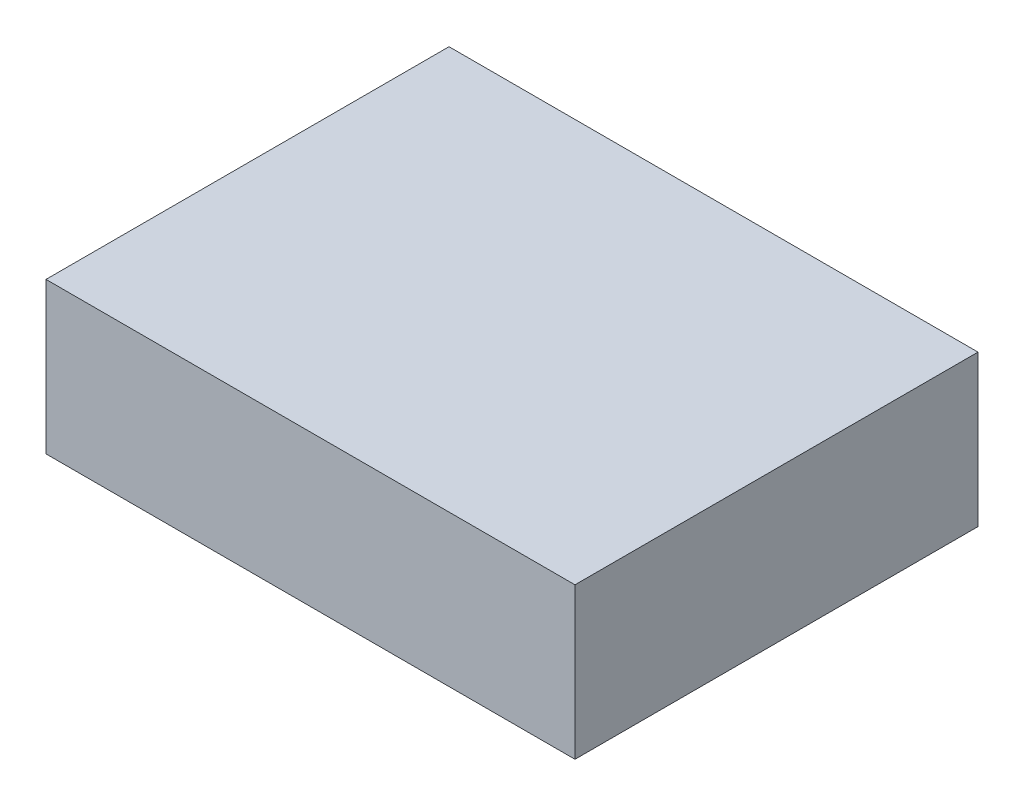
ISO-10303-21;
HEADER;
FILE_DESCRIPTION(('STEP AP214'),'2;1');
FILE_NAME('part.step','',(''),(''),'','','');
FILE_SCHEMA(('AUTOMOTIVE_DESIGN { 1 0 10303 214 1 1 1 1 }'));
ENDSEC;
DATA;
#1=APPLICATION_CONTEXT('core data for automotive mechanical design processes');
#2=APPLICATION_PROTOCOL_DEFINITION('international standard','automotive_design',2000,#1);
#3=PRODUCT_CONTEXT('',#1,'mechanical');
#4=PRODUCT('Part','Part','',(#3));
#5=PRODUCT_RELATED_PRODUCT_CATEGORY('part','',(#4));
#6=PRODUCT_DEFINITION_FORMATION('','',#4);
#7=PRODUCT_DEFINITION_CONTEXT('part definition',#1,'design');
#8=PRODUCT_DEFINITION('design','',#6,#7);
#9=PRODUCT_DEFINITION_SHAPE('','',#8);
#10=(LENGTH_UNIT() NAMED_UNIT(*) SI_UNIT(.MILLI.,.METRE.));
#11=(NAMED_UNIT(*) PLANE_ANGLE_UNIT() SI_UNIT($,.RADIAN.));
#12=(NAMED_UNIT(*) SI_UNIT($,.STERADIAN.) SOLID_ANGLE_UNIT());
#13=UNCERTAINTY_MEASURE_WITH_UNIT(LENGTH_MEASURE(1.E-05),#10,'distance_accuracy_value','');
#14=(GEOMETRIC_REPRESENTATION_CONTEXT(3) GLOBAL_UNCERTAINTY_ASSIGNED_CONTEXT((#13)) GLOBAL_UNIT_ASSIGNED_CONTEXT((#10,
#11,#12)) REPRESENTATION_CONTEXT('',''));
#15=CARTESIAN_POINT('',(0.,0.,0.));
#16=DIRECTION('',(0.,0.,1.));
#17=DIRECTION('',(1.,0.,0.));
#18=AXIS2_PLACEMENT_3D('',#15,#16,#17);
#19=CARTESIAN_POINT('',(21.,6.,-32.));
#20=DIRECTION('',(1.,0.,0.));
#21=DIRECTION('',(0.,0.,-1.));
#22=AXIS2_PLACEMENT_3D('',#19,#20,#21);
#23=PLANE('',#22);
#24=DIRECTION('',(0.,1.,0.));
#25=VECTOR('',#24,1.);
#26=CARTESIAN_POINT('',(21.,6.,0.));
#27=LINE('',#26,#25);
#28=CARTESIAN_POINT('',(21.,-6.,0.));
#29=VERTEX_POINT('',#28);
#30=CARTESIAN_POINT('',(21.,6.,0.));
#31=VERTEX_POINT('',#30);
#32=EDGE_CURVE('E113',#29,#31,#27,.T.);
#33=ORIENTED_EDGE('',*,*,#32,.F.);
#34=DIRECTION('',(0.,0.,1.));
#35=VECTOR('',#34,1.);
#36=CARTESIAN_POINT('',(21.,-6.,-32.));
#37=LINE('',#36,#35);
#38=CARTESIAN_POINT('',(21.,-6.,-32.));
#39=VERTEX_POINT('',#38);
#40=EDGE_CURVE('E11',#39,#29,#37,.T.);
#41=ORIENTED_EDGE('',*,*,#40,.F.);
#42=DIRECTION('',(0.,1.,0.));
#43=VECTOR('',#42,1.);
#44=CARTESIAN_POINT('',(21.,6.,-32.));
#45=LINE('',#44,#43);
#46=CARTESIAN_POINT('',(21.,6.,-32.));
#47=VERTEX_POINT('',#46);
#48=EDGE_CURVE('E105',#39,#47,#45,.T.);
#49=ORIENTED_EDGE('',*,*,#48,.T.);
#50=DIRECTION('',(0.,0.,1.));
#51=VECTOR('',#50,1.);
#52=CARTESIAN_POINT('',(21.,6.,-32.));
#53=LINE('',#52,#51);
#54=EDGE_CURVE('E46',#47,#31,#53,.T.);
#55=ORIENTED_EDGE('',*,*,#54,.T.);
#56=EDGE_LOOP('',(#33,#41,#49,#55));
#57=FACE_BOUND('',#56,.T.);
#58=ADVANCED_FACE('F43',(#57),#23,.T.);
#59=CARTESIAN_POINT('',(-21.,-6.,-32.));
#60=DIRECTION('',(0.,-1.,0.));
#61=DIRECTION('',(0.,0.,-1.));
#62=AXIS2_PLACEMENT_3D('',#59,#60,#61);
#63=PLANE('',#62);
#64=DIRECTION('',(1.,0.,0.));
#65=VECTOR('',#64,1.);
#66=CARTESIAN_POINT('',(-21.,-6.,0.));
#67=LINE('',#66,#65);
#68=CARTESIAN_POINT('',(-21.,-6.,0.));
#69=VERTEX_POINT('',#68);
#70=EDGE_CURVE('E108',#69,#29,#67,.T.);
#71=ORIENTED_EDGE('',*,*,#70,.F.);
#72=DIRECTION('',(0.,0.,1.));
#73=VECTOR('',#72,1.);
#74=CARTESIAN_POINT('',(-21.,-6.,-32.));
#75=LINE('',#74,#73);
#76=CARTESIAN_POINT('',(-21.,-6.,-32.));
#77=VERTEX_POINT('',#76);
#78=EDGE_CURVE('E53',#77,#69,#75,.T.);
#79=ORIENTED_EDGE('',*,*,#78,.F.);
#80=DIRECTION('',(1.,0.,0.));
#81=VECTOR('',#80,1.);
#82=CARTESIAN_POINT('',(-21.,-6.,-32.));
#83=LINE('',#82,#81);
#84=EDGE_CURVE('E100',#77,#39,#83,.T.);
#85=ORIENTED_EDGE('',*,*,#84,.T.);
#86=ORIENTED_EDGE('',*,*,#40,.T.);
#87=EDGE_LOOP('',(#71,#79,#85,#86));
#88=FACE_BOUND('',#87,.T.);
#89=ADVANCED_FACE('F129',(#88),#63,.T.);
#90=CARTESIAN_POINT('',(-21.,6.,-32.));
#91=DIRECTION('',(-1.,0.,0.));
#92=DIRECTION('',(0.,-1.,0.));
#93=AXIS2_PLACEMENT_3D('',#90,#91,#92);
#94=PLANE('',#93);
#95=DIRECTION('',(0.,-1.,0.));
#96=VECTOR('',#95,1.);
#97=CARTESIAN_POINT('',(-21.,6.,0.));
#98=LINE('',#97,#96);
#99=CARTESIAN_POINT('',(-21.,6.,0.));
#100=VERTEX_POINT('',#99);
#101=EDGE_CURVE('E94',#100,#69,#98,.T.);
#102=ORIENTED_EDGE('',*,*,#101,.F.);
#103=DIRECTION('',(0.,0.,1.));
#104=VECTOR('',#103,1.);
#105=CARTESIAN_POINT('',(-21.,6.,-32.));
#106=LINE('',#105,#104);
#107=CARTESIAN_POINT('',(-21.,6.,-32.));
#108=VERTEX_POINT('',#107);
#109=EDGE_CURVE('E89',#108,#100,#106,.T.);
#110=ORIENTED_EDGE('',*,*,#109,.F.);
#111=DIRECTION('',(0.,-1.,0.));
#112=VECTOR('',#111,1.);
#113=CARTESIAN_POINT('',(-21.,6.,-32.));
#114=LINE('',#113,#112);
#115=EDGE_CURVE('E92',#108,#77,#114,.T.);
#116=ORIENTED_EDGE('',*,*,#115,.T.);
#117=ORIENTED_EDGE('',*,*,#78,.T.);
#118=EDGE_LOOP('',(#102,#110,#116,#117));
#119=FACE_BOUND('',#118,.T.);
#120=ADVANCED_FACE('F91',(#119),#94,.T.);
#121=CARTESIAN_POINT('',(-21.,6.,-32.));
#122=DIRECTION('',(0.,1.,0.));
#123=DIRECTION('',(0.,0.,1.));
#124=AXIS2_PLACEMENT_3D('',#121,#122,#123);
#125=PLANE('',#124);
#126=DIRECTION('',(-1.,0.,0.));
#127=VECTOR('',#126,1.);
#128=CARTESIAN_POINT('',(-21.,6.,0.));
#129=LINE('',#128,#127);
#130=EDGE_CURVE('E117',#31,#100,#129,.T.);
#131=ORIENTED_EDGE('',*,*,#130,.F.);
#132=ORIENTED_EDGE('',*,*,#54,.F.);
#133=DIRECTION('',(-1.,0.,0.));
#134=VECTOR('',#133,1.);
#135=CARTESIAN_POINT('',(-21.,6.,-32.));
#136=LINE('',#135,#134);
#137=EDGE_CURVE('E99',#47,#108,#136,.T.);
#138=ORIENTED_EDGE('',*,*,#137,.T.);
#139=ORIENTED_EDGE('',*,*,#109,.T.);
#140=EDGE_LOOP('',(#131,#132,#138,#139));
#141=FACE_BOUND('',#140,.T.);
#142=ADVANCED_FACE('F103',(#141),#125,.T.);
#143=CARTESIAN_POINT('',(0.,0.,-32.));
#144=DIRECTION('',(0.,0.,1.));
#145=DIRECTION('',(1.,0.,0.));
#146=AXIS2_PLACEMENT_3D('',#143,#144,#145);
#147=PLANE('',#146);
#148=ORIENTED_EDGE('',*,*,#48,.F.);
#149=ORIENTED_EDGE('',*,*,#84,.F.);
#150=ORIENTED_EDGE('',*,*,#115,.F.);
#151=ORIENTED_EDGE('',*,*,#137,.F.);
#152=EDGE_LOOP('',(#148,#149,#150,#151));
#153=FACE_BOUND('',#152,.T.);
#154=ADVANCED_FACE('F98',(#153),#147,.F.);
#155=CARTESIAN_POINT('',(0.,0.,0.));
#156=DIRECTION('',(0.,0.,1.));
#157=DIRECTION('',(1.,0.,0.));
#158=AXIS2_PLACEMENT_3D('',#155,#156,#157);
#159=PLANE('',#158);
#160=ORIENTED_EDGE('',*,*,#32,.T.);
#161=ORIENTED_EDGE('',*,*,#130,.T.);
#162=ORIENTED_EDGE('',*,*,#101,.T.);
#163=ORIENTED_EDGE('',*,*,#70,.T.);
#164=EDGE_LOOP('',(#160,#161,#162,#163));
#165=FACE_BOUND('',#164,.T.);
#166=ADVANCED_FACE('F128',(#165),#159,.T.);
#167=CLOSED_SHELL('',(#58,#89,#120,#142,#154,#166));
#168=MANIFOLD_SOLID_BREP('B2',#167);
#169=ADVANCED_BREP_SHAPE_REPRESENTATION('',(#18,#168),#14);
#170=SHAPE_DEFINITION_REPRESENTATION(#9,#169);
ENDSEC;
END-ISO-10303-21;
